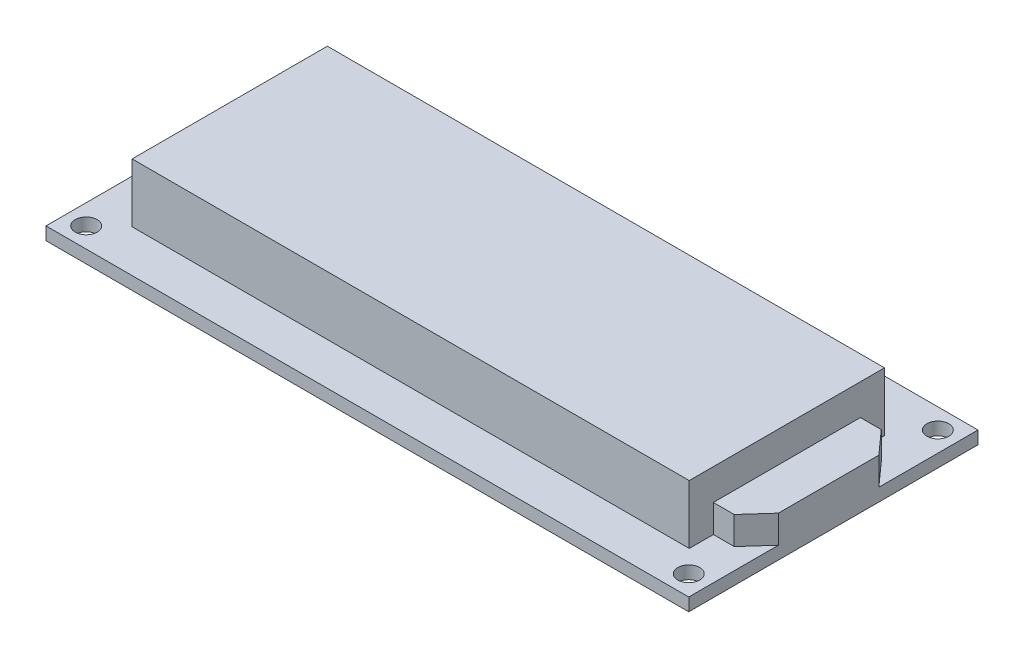
ISO-10303-21;
HEADER;
FILE_DESCRIPTION(('STEP AP214'),'2;1');
FILE_NAME('part.step','',(''),(''),'','','');
FILE_SCHEMA(('AUTOMOTIVE_DESIGN { 1 0 10303 214 1 1 1 1 }'));
ENDSEC;
DATA;
#1=APPLICATION_CONTEXT('core data for automotive mechanical design processes');
#2=APPLICATION_PROTOCOL_DEFINITION('international standard','automotive_design',2000,#1);
#3=PRODUCT_CONTEXT('',#1,'mechanical');
#4=PRODUCT('Part','Part','',(#3));
#5=PRODUCT_RELATED_PRODUCT_CATEGORY('part','',(#4));
#6=PRODUCT_DEFINITION_FORMATION('','',#4);
#7=PRODUCT_DEFINITION_CONTEXT('part definition',#1,'design');
#8=PRODUCT_DEFINITION('design','',#6,#7);
#9=PRODUCT_DEFINITION_SHAPE('','',#8);
#10=(LENGTH_UNIT() NAMED_UNIT(*) SI_UNIT(.MILLI.,.METRE.));
#11=(NAMED_UNIT(*) PLANE_ANGLE_UNIT() SI_UNIT($,.RADIAN.));
#12=(NAMED_UNIT(*) SI_UNIT($,.STERADIAN.) SOLID_ANGLE_UNIT());
#13=UNCERTAINTY_MEASURE_WITH_UNIT(LENGTH_MEASURE(1.E-05),#10,'distance_accuracy_value','');
#14=(GEOMETRIC_REPRESENTATION_CONTEXT(3) GLOBAL_UNCERTAINTY_ASSIGNED_CONTEXT((#13)) GLOBAL_UNIT_ASSIGNED_CONTEXT((#10,
#11,#12)) REPRESENTATION_CONTEXT('',''));
#15=CARTESIAN_POINT('',(0.,0.,0.));
#16=DIRECTION('',(0.,0.,1.));
#17=DIRECTION('',(1.,0.,0.));
#18=AXIS2_PLACEMENT_3D('',#15,#16,#17);
#19=CARTESIAN_POINT('',(0.,1.6,0.));
#20=DIRECTION('',(0.,-1.,0.));
#21=DIRECTION('',(0.,0.,-1.));
#22=AXIS2_PLACEMENT_3D('',#19,#20,#21);
#23=PLANE('',#22);
#24=CARTESIAN_POINT('',(37.5,1.6,-15.5));
#25=DIRECTION('',(0.,-1.,0.));
#26=DIRECTION('',(0.,0.,-1.));
#27=AXIS2_PLACEMENT_3D('',#24,#25,#26);
#28=CIRCLE('',#27,1.36);
#29=CARTESIAN_POINT('',(37.5,1.6,-16.86));
#30=VERTEX_POINT('',#29);
#31=EDGE_CURVE('E169',#30,#30,#28,.T.);
#32=ORIENTED_EDGE('',*,*,#31,.T.);
#33=EDGE_LOOP('',(#32));
#34=FACE_BOUND('',#33,.T.);
#35=CARTESIAN_POINT('',(37.5,1.6,15.5));
#36=DIRECTION('',(0.,-1.,0.));
#37=DIRECTION('',(0.,0.,-1.));
#38=AXIS2_PLACEMENT_3D('',#35,#36,#37);
#39=CIRCLE('',#38,1.36);
#40=CARTESIAN_POINT('',(37.5,1.6,14.14));
#41=VERTEX_POINT('',#40);
#42=EDGE_CURVE('E403',#41,#41,#39,.T.);
#43=ORIENTED_EDGE('',*,*,#42,.T.);
#44=EDGE_LOOP('',(#43));
#45=FACE_BOUND('',#44,.T.);
#46=CARTESIAN_POINT('',(-37.5,1.6,15.5));
#47=DIRECTION('',(0.,-1.,0.));
#48=DIRECTION('',(0.,0.,-1.));
#49=AXIS2_PLACEMENT_3D('',#46,#47,#48);
#50=CIRCLE('',#49,1.36);
#51=CARTESIAN_POINT('',(-37.5,1.6,14.14));
#52=VERTEX_POINT('',#51);
#53=EDGE_CURVE('E406',#52,#52,#50,.T.);
#54=ORIENTED_EDGE('',*,*,#53,.T.);
#55=EDGE_LOOP('',(#54));
#56=FACE_BOUND('',#55,.T.);
#57=CARTESIAN_POINT('',(-37.5,1.6,-15.5));
#58=DIRECTION('',(0.,-1.,0.));
#59=DIRECTION('',(0.,0.,-1.));
#60=AXIS2_PLACEMENT_3D('',#57,#58,#59);
#61=CIRCLE('',#60,1.36);
#62=CARTESIAN_POINT('',(-37.5,1.6,-16.86));
#63=VERTEX_POINT('',#62);
#64=EDGE_CURVE('E411',#63,#63,#61,.T.);
#65=ORIENTED_EDGE('',*,*,#64,.T.);
#66=EDGE_LOOP('',(#65));
#67=FACE_BOUND('',#66,.T.);
#68=DIRECTION('',(1.,0.,0.));
#69=VECTOR('',#68,1.);
#70=CARTESIAN_POINT('',(37.4,1.6,9.74));
#71=LINE('',#70,#69);
#72=CARTESIAN_POINT('',(34.8,1.6,9.74));
#73=VERTEX_POINT('',#72);
#74=CARTESIAN_POINT('',(37.4,1.6,9.74));
#75=VERTEX_POINT('',#74);
#76=EDGE_CURVE('E168',#73,#75,#71,.T.);
#77=ORIENTED_EDGE('',*,*,#76,.F.);
#78=DIRECTION('',(0.,0.,-1.));
#79=VECTOR('',#78,1.);
#80=CARTESIAN_POINT('',(34.8,1.6,-11.56));
#81=LINE('',#80,#79);
#82=CARTESIAN_POINT('',(34.8,1.6,12.74));
#83=VERTEX_POINT('',#82);
#84=EDGE_CURVE('E140',#83,#73,#81,.T.);
#85=ORIENTED_EDGE('',*,*,#84,.F.);
#86=DIRECTION('',(1.,0.,0.));
#87=VECTOR('',#86,1.);
#88=CARTESIAN_POINT('',(-34.54,1.6,12.74));
#89=LINE('',#88,#87);
#90=CARTESIAN_POINT('',(-34.54,1.6,12.74));
#91=VERTEX_POINT('',#90);
#92=EDGE_CURVE('E189',#91,#83,#89,.T.);
#93=ORIENTED_EDGE('',*,*,#92,.F.);
#94=DIRECTION('',(0.,0.,1.));
#95=VECTOR('',#94,1.);
#96=CARTESIAN_POINT('',(-34.54,1.6,-11.56));
#97=LINE('',#96,#95);
#98=CARTESIAN_POINT('',(-34.54,1.6,-11.56));
#99=VERTEX_POINT('',#98);
#100=EDGE_CURVE('E200',#99,#91,#97,.T.);
#101=ORIENTED_EDGE('',*,*,#100,.F.);
#102=DIRECTION('',(-1.,0.,0.));
#103=VECTOR('',#102,1.);
#104=CARTESIAN_POINT('',(-34.54,1.6,-11.56));
#105=LINE('',#104,#103);
#106=CARTESIAN_POINT('',(34.8,1.6,-11.56));
#107=VERTEX_POINT('',#106);
#108=EDGE_CURVE('E197',#107,#99,#105,.T.);
#109=ORIENTED_EDGE('',*,*,#108,.F.);
#110=CARTESIAN_POINT('',(34.8,1.6,-8.56));
#111=VERTEX_POINT('',#110);
#112=EDGE_CURVE('E184',#111,#107,#81,.T.);
#113=ORIENTED_EDGE('',*,*,#112,.F.);
#114=DIRECTION('',(-1.,0.,0.));
#115=VECTOR('',#114,1.);
#116=CARTESIAN_POINT('',(34.8,1.6,-8.56));
#117=LINE('',#116,#115);
#118=CARTESIAN_POINT('',(37.4,1.6,-8.56));
#119=VERTEX_POINT('',#118);
#120=EDGE_CURVE('E55',#119,#111,#117,.T.);
#121=ORIENTED_EDGE('',*,*,#120,.F.);
#122=DIRECTION('',(-0.667545015752028,0.,-0.744569440646489));
#123=VECTOR('',#122,1.);
#124=CARTESIAN_POINT('',(37.4,1.6,-8.56));
#125=LINE('',#124,#123);
#126=CARTESIAN_POINT('',(40.,1.6,-5.66));
#127=VERTEX_POINT('',#126);
#128=EDGE_CURVE('E172',#127,#119,#125,.T.);
#129=ORIENTED_EDGE('',*,*,#128,.F.);
#130=DIRECTION('',(0.,0.,-1.));
#131=VECTOR('',#130,1.);
#132=CARTESIAN_POINT('',(40.,1.6,-18.));
#133=LINE('',#132,#131);
#134=CARTESIAN_POINT('',(40.,1.6,-18.));
#135=VERTEX_POINT('',#134);
#136=EDGE_CURVE('E222',#127,#135,#133,.T.);
#137=ORIENTED_EDGE('',*,*,#136,.T.);
#138=DIRECTION('',(-1.,0.,0.));
#139=VECTOR('',#138,1.);
#140=CARTESIAN_POINT('',(40.,1.6,-18.));
#141=LINE('',#140,#139);
#142=CARTESIAN_POINT('',(-40.,1.6,-18.));
#143=VERTEX_POINT('',#142);
#144=EDGE_CURVE('E225',#135,#143,#141,.T.);
#145=ORIENTED_EDGE('',*,*,#144,.T.);
#146=DIRECTION('',(0.,0.,1.));
#147=VECTOR('',#146,1.);
#148=CARTESIAN_POINT('',(-40.,1.6,-18.));
#149=LINE('',#148,#147);
#150=CARTESIAN_POINT('',(-40.,1.6,18.));
#151=VERTEX_POINT('',#150);
#152=EDGE_CURVE('E216',#143,#151,#149,.T.);
#153=ORIENTED_EDGE('',*,*,#152,.T.);
#154=DIRECTION('',(1.,0.,0.));
#155=VECTOR('',#154,1.);
#156=CARTESIAN_POINT('',(40.,1.6,18.));
#157=LINE('',#156,#155);
#158=CARTESIAN_POINT('',(40.,1.6,18.));
#159=VERTEX_POINT('',#158);
#160=EDGE_CURVE('E219',#151,#159,#157,.T.);
#161=ORIENTED_EDGE('',*,*,#160,.T.);
#162=CARTESIAN_POINT('',(40.,1.6,6.84));
#163=VERTEX_POINT('',#162);
#164=EDGE_CURVE('E223',#159,#163,#133,.T.);
#165=ORIENTED_EDGE('',*,*,#164,.T.);
#166=DIRECTION('',(0.667545015752028,0.,-0.744569440646489));
#167=VECTOR('',#166,1.);
#168=CARTESIAN_POINT('',(40.,1.6,6.84));
#169=LINE('',#168,#167);
#170=EDGE_CURVE('E48',#75,#163,#169,.T.);
#171=ORIENTED_EDGE('',*,*,#170,.F.);
#172=EDGE_LOOP('',(#77,#85,#93,#101,#109,#113,#121,#129,#137,#145,#153,#161,#165,#171));
#173=FACE_BOUND('',#172,.T.);
#174=ADVANCED_FACE('F33',(#34,#45,#56,#67,#173),#23,.F.);
#175=CARTESIAN_POINT('',(34.8,8.92,-11.56));
#176=DIRECTION('',(-1.,0.,0.));
#177=DIRECTION('',(0.,0.,1.));
#178=AXIS2_PLACEMENT_3D('',#175,#176,#177);
#179=PLANE('',#178);
#180=DIRECTION('',(0.,-1.,0.));
#181=VECTOR('',#180,1.);
#182=CARTESIAN_POINT('',(34.8,5.06,-8.56));
#183=LINE('',#182,#181);
#184=CARTESIAN_POINT('',(34.8,5.06,-8.56));
#185=VERTEX_POINT('',#184);
#186=EDGE_CURVE('E143',#185,#111,#183,.T.);
#187=ORIENTED_EDGE('',*,*,#186,.T.);
#188=ORIENTED_EDGE('',*,*,#112,.T.);
#189=DIRECTION('',(0.,-1.,0.));
#190=VECTOR('',#189,1.);
#191=CARTESIAN_POINT('',(34.8,8.92,-11.56));
#192=LINE('',#191,#190);
#193=CARTESIAN_POINT('',(34.8,8.92,-11.56));
#194=VERTEX_POINT('',#193);
#195=EDGE_CURVE('E212',#194,#107,#192,.T.);
#196=ORIENTED_EDGE('',*,*,#195,.F.);
#197=DIRECTION('',(0.,0.,-1.));
#198=VECTOR('',#197,1.);
#199=CARTESIAN_POINT('',(34.8,8.92,-11.56));
#200=LINE('',#199,#198);
#201=CARTESIAN_POINT('',(34.8,8.92,12.74));
#202=VERTEX_POINT('',#201);
#203=EDGE_CURVE('E185',#202,#194,#200,.T.);
#204=ORIENTED_EDGE('',*,*,#203,.F.);
#205=DIRECTION('',(0.,-1.,0.));
#206=VECTOR('',#205,1.);
#207=CARTESIAN_POINT('',(34.8,8.92,12.74));
#208=LINE('',#207,#206);
#209=EDGE_CURVE('E195',#202,#83,#208,.T.);
#210=ORIENTED_EDGE('',*,*,#209,.T.);
#211=ORIENTED_EDGE('',*,*,#84,.T.);
#212=DIRECTION('',(0.,-1.,0.));
#213=VECTOR('',#212,1.);
#214=CARTESIAN_POINT('',(34.8,5.06,9.74));
#215=LINE('',#214,#213);
#216=CARTESIAN_POINT('',(34.8,5.06,9.74));
#217=VERTEX_POINT('',#216);
#218=EDGE_CURVE('E134',#217,#73,#215,.T.);
#219=ORIENTED_EDGE('',*,*,#218,.F.);
#220=DIRECTION('',(0.,0.,1.));
#221=VECTOR('',#220,1.);
#222=CARTESIAN_POINT('',(34.8,5.06,9.74));
#223=LINE('',#222,#221);
#224=EDGE_CURVE('E137',#185,#217,#223,.T.);
#225=ORIENTED_EDGE('',*,*,#224,.F.);
#226=EDGE_LOOP('',(#187,#188,#196,#204,#210,#211,#219,#225));
#227=FACE_BOUND('',#226,.T.);
#228=ADVANCED_FACE('F136',(#227),#179,.F.);
#229=CARTESIAN_POINT('',(-40.,1.6,-18.));
#230=DIRECTION('',(1.,0.,0.));
#231=DIRECTION('',(0.,0.,-1.));
#232=AXIS2_PLACEMENT_3D('',#229,#230,#231);
#233=PLANE('',#232);
#234=DIRECTION('',(0.,0.,1.));
#235=VECTOR('',#234,1.);
#236=CARTESIAN_POINT('',(-40.,0.,-18.));
#237=LINE('',#236,#235);
#238=CARTESIAN_POINT('',(-40.,0.,-18.));
#239=VERTEX_POINT('',#238);
#240=CARTESIAN_POINT('',(-40.,0.,18.));
#241=VERTEX_POINT('',#240);
#242=EDGE_CURVE('E215',#239,#241,#237,.T.);
#243=ORIENTED_EDGE('',*,*,#242,.T.);
#244=DIRECTION('',(0.,-1.,0.));
#245=VECTOR('',#244,1.);
#246=CARTESIAN_POINT('',(-40.,1.6,18.));
#247=LINE('',#246,#245);
#248=EDGE_CURVE('E11',#151,#241,#247,.T.);
#249=ORIENTED_EDGE('',*,*,#248,.F.);
#250=ORIENTED_EDGE('',*,*,#152,.F.);
#251=DIRECTION('',(0.,-1.,0.));
#252=VECTOR('',#251,1.);
#253=CARTESIAN_POINT('',(-40.,1.6,-18.));
#254=LINE('',#253,#252);
#255=EDGE_CURVE('E227',#143,#239,#254,.T.);
#256=ORIENTED_EDGE('',*,*,#255,.T.);
#257=EDGE_LOOP('',(#243,#249,#250,#256));
#258=FACE_BOUND('',#257,.T.);
#259=ADVANCED_FACE('F35',(#258),#233,.F.);
#260=CARTESIAN_POINT('',(40.,1.6,18.));
#261=DIRECTION('',(0.,0.,-1.));
#262=DIRECTION('',(-1.,0.,0.));
#263=AXIS2_PLACEMENT_3D('',#260,#261,#262);
#264=PLANE('',#263);
#265=DIRECTION('',(1.,0.,0.));
#266=VECTOR('',#265,1.);
#267=CARTESIAN_POINT('',(40.,0.,18.));
#268=LINE('',#267,#266);
#269=CARTESIAN_POINT('',(40.,0.,18.));
#270=VERTEX_POINT('',#269);
#271=EDGE_CURVE('E230',#241,#270,#268,.T.);
#272=ORIENTED_EDGE('',*,*,#271,.T.);
#273=DIRECTION('',(0.,-1.,0.));
#274=VECTOR('',#273,1.);
#275=CARTESIAN_POINT('',(40.,1.6,18.));
#276=LINE('',#275,#274);
#277=EDGE_CURVE('E41',#159,#270,#276,.T.);
#278=ORIENTED_EDGE('',*,*,#277,.F.);
#279=ORIENTED_EDGE('',*,*,#160,.F.);
#280=ORIENTED_EDGE('',*,*,#248,.T.);
#281=EDGE_LOOP('',(#272,#278,#279,#280));
#282=FACE_BOUND('',#281,.T.);
#283=ADVANCED_FACE('F296',(#282),#264,.F.);
#284=CARTESIAN_POINT('',(40.,1.6,-18.));
#285=DIRECTION('',(-1.,0.,0.));
#286=DIRECTION('',(0.,0.,1.));
#287=AXIS2_PLACEMENT_3D('',#284,#285,#286);
#288=PLANE('',#287);
#289=DIRECTION('',(0.,0.,-1.));
#290=VECTOR('',#289,1.);
#291=CARTESIAN_POINT('',(40.,0.,-18.));
#292=LINE('',#291,#290);
#293=CARTESIAN_POINT('',(40.,0.,-18.));
#294=VERTEX_POINT('',#293);
#295=EDGE_CURVE('E232',#270,#294,#292,.T.);
#296=ORIENTED_EDGE('',*,*,#295,.T.);
#297=DIRECTION('',(0.,-1.,0.));
#298=VECTOR('',#297,1.);
#299=CARTESIAN_POINT('',(40.,1.6,-18.));
#300=LINE('',#299,#298);
#301=EDGE_CURVE('E237',#135,#294,#300,.T.);
#302=ORIENTED_EDGE('',*,*,#301,.F.);
#303=ORIENTED_EDGE('',*,*,#136,.F.);
#304=DIRECTION('',(0.,-1.,0.));
#305=VECTOR('',#304,1.);
#306=CARTESIAN_POINT('',(40.,5.06,-5.66));
#307=LINE('',#306,#305);
#308=CARTESIAN_POINT('',(40.,5.06,-5.66));
#309=VERTEX_POINT('',#308);
#310=EDGE_CURVE('E176',#309,#127,#307,.T.);
#311=ORIENTED_EDGE('',*,*,#310,.F.);
#312=DIRECTION('',(0.,0.,-1.));
#313=VECTOR('',#312,1.);
#314=CARTESIAN_POINT('',(40.,5.06,-5.66));
#315=LINE('',#314,#313);
#316=CARTESIAN_POINT('',(40.,5.06,6.84));
#317=VERTEX_POINT('',#316);
#318=EDGE_CURVE('E159',#317,#309,#315,.T.);
#319=ORIENTED_EDGE('',*,*,#318,.F.);
#320=DIRECTION('',(0.,-1.,0.));
#321=VECTOR('',#320,1.);
#322=CARTESIAN_POINT('',(40.,5.06,6.84));
#323=LINE('',#322,#321);
#324=EDGE_CURVE('E179',#317,#163,#323,.T.);
#325=ORIENTED_EDGE('',*,*,#324,.T.);
#326=ORIENTED_EDGE('',*,*,#164,.F.);
#327=ORIENTED_EDGE('',*,*,#277,.T.);
#328=EDGE_LOOP('',(#296,#302,#303,#311,#319,#325,#326,#327));
#329=FACE_BOUND('',#328,.T.);
#330=ADVANCED_FACE('F244',(#329),#288,.F.);
#331=CARTESIAN_POINT('',(40.,1.6,-18.));
#332=DIRECTION('',(0.,0.,1.));
#333=DIRECTION('',(1.,0.,0.));
#334=AXIS2_PLACEMENT_3D('',#331,#332,#333);
#335=PLANE('',#334);
#336=DIRECTION('',(-1.,0.,0.));
#337=VECTOR('',#336,1.);
#338=CARTESIAN_POINT('',(40.,0.,-18.));
#339=LINE('',#338,#337);
#340=EDGE_CURVE('E220',#294,#239,#339,.T.);
#341=ORIENTED_EDGE('',*,*,#340,.T.);
#342=ORIENTED_EDGE('',*,*,#255,.F.);
#343=ORIENTED_EDGE('',*,*,#144,.F.);
#344=ORIENTED_EDGE('',*,*,#301,.T.);
#345=EDGE_LOOP('',(#341,#342,#343,#344));
#346=FACE_BOUND('',#345,.T.);
#347=ADVANCED_FACE('F253',(#346),#335,.F.);
#348=CARTESIAN_POINT('',(0.,0.,0.));
#349=DIRECTION('',(0.,-1.,0.));
#350=DIRECTION('',(0.,0.,-1.));
#351=AXIS2_PLACEMENT_3D('',#348,#349,#350);
#352=PLANE('',#351);
#353=CARTESIAN_POINT('',(37.5,0.,-15.5));
#354=DIRECTION('',(0.,1.,0.));
#355=DIRECTION('',(0.,0.,1.));
#356=AXIS2_PLACEMENT_3D('',#353,#354,#355);
#357=CIRCLE('',#356,1.36);
#358=CARTESIAN_POINT('',(37.5,0.,-14.14));
#359=VERTEX_POINT('',#358);
#360=EDGE_CURVE('E401',#359,#359,#357,.T.);
#361=ORIENTED_EDGE('',*,*,#360,.T.);
#362=EDGE_LOOP('',(#361));
#363=FACE_BOUND('',#362,.T.);
#364=CARTESIAN_POINT('',(37.5,0.,15.5));
#365=DIRECTION('',(0.,1.,0.));
#366=DIRECTION('',(0.,0.,1.));
#367=AXIS2_PLACEMENT_3D('',#364,#365,#366);
#368=CIRCLE('',#367,1.36);
#369=CARTESIAN_POINT('',(37.5,0.,16.86));
#370=VERTEX_POINT('',#369);
#371=EDGE_CURVE('E419',#370,#370,#368,.T.);
#372=ORIENTED_EDGE('',*,*,#371,.T.);
#373=EDGE_LOOP('',(#372));
#374=FACE_BOUND('',#373,.T.);
#375=CARTESIAN_POINT('',(-37.5,0.,15.5));
#376=DIRECTION('',(0.,1.,0.));
#377=DIRECTION('',(0.,0.,1.));
#378=AXIS2_PLACEMENT_3D('',#375,#376,#377);
#379=CIRCLE('',#378,1.36);
#380=CARTESIAN_POINT('',(-37.5,0.,16.86));
#381=VERTEX_POINT('',#380);
#382=EDGE_CURVE('E417',#381,#381,#379,.T.);
#383=ORIENTED_EDGE('',*,*,#382,.T.);
#384=EDGE_LOOP('',(#383));
#385=FACE_BOUND('',#384,.T.);
#386=CARTESIAN_POINT('',(-37.5,0.,-15.5));
#387=DIRECTION('',(0.,1.,0.));
#388=DIRECTION('',(0.,0.,1.));
#389=AXIS2_PLACEMENT_3D('',#386,#387,#388);
#390=CIRCLE('',#389,1.36);
#391=CARTESIAN_POINT('',(-37.5,0.,-14.14));
#392=VERTEX_POINT('',#391);
#393=EDGE_CURVE('E414',#392,#392,#390,.T.);
#394=ORIENTED_EDGE('',*,*,#393,.T.);
#395=EDGE_LOOP('',(#394));
#396=FACE_BOUND('',#395,.T.);
#397=ORIENTED_EDGE('',*,*,#242,.F.);
#398=ORIENTED_EDGE('',*,*,#340,.F.);
#399=ORIENTED_EDGE('',*,*,#295,.F.);
#400=ORIENTED_EDGE('',*,*,#271,.F.);
#401=EDGE_LOOP('',(#397,#398,#399,#400));
#402=FACE_BOUND('',#401,.T.);
#403=ADVANCED_FACE('F250',(#363,#374,#385,#396,#402),#352,.T.);
#404=CARTESIAN_POINT('',(-34.54,8.92,-11.56));
#405=DIRECTION('',(0.,0.,1.));
#406=DIRECTION('',(1.,0.,0.));
#407=AXIS2_PLACEMENT_3D('',#404,#405,#406);
#408=PLANE('',#407);
#409=ORIENTED_EDGE('',*,*,#108,.T.);
#410=DIRECTION('',(0.,-1.,0.));
#411=VECTOR('',#410,1.);
#412=CARTESIAN_POINT('',(-34.54,8.92,-11.56));
#413=LINE('',#412,#411);
#414=CARTESIAN_POINT('',(-34.54,8.92,-11.56));
#415=VERTEX_POINT('',#414);
#416=EDGE_CURVE('E209',#415,#99,#413,.T.);
#417=ORIENTED_EDGE('',*,*,#416,.F.);
#418=DIRECTION('',(-1.,0.,0.));
#419=VECTOR('',#418,1.);
#420=CARTESIAN_POINT('',(-34.54,8.92,-11.56));
#421=LINE('',#420,#419);
#422=EDGE_CURVE('E188',#194,#415,#421,.T.);
#423=ORIENTED_EDGE('',*,*,#422,.F.);
#424=ORIENTED_EDGE('',*,*,#195,.T.);
#425=EDGE_LOOP('',(#409,#417,#423,#424));
#426=FACE_BOUND('',#425,.T.);
#427=ADVANCED_FACE('F291',(#426),#408,.F.);
#428=CARTESIAN_POINT('',(-34.54,8.92,-11.56));
#429=DIRECTION('',(1.,0.,0.));
#430=DIRECTION('',(0.,0.,-1.));
#431=AXIS2_PLACEMENT_3D('',#428,#429,#430);
#432=PLANE('',#431);
#433=ORIENTED_EDGE('',*,*,#100,.T.);
#434=DIRECTION('',(0.,-1.,0.));
#435=VECTOR('',#434,1.);
#436=CARTESIAN_POINT('',(-34.54,8.92,12.74));
#437=LINE('',#436,#435);
#438=CARTESIAN_POINT('',(-34.54,8.92,12.74));
#439=VERTEX_POINT('',#438);
#440=EDGE_CURVE('E206',#439,#91,#437,.T.);
#441=ORIENTED_EDGE('',*,*,#440,.F.);
#442=DIRECTION('',(0.,0.,1.));
#443=VECTOR('',#442,1.);
#444=CARTESIAN_POINT('',(-34.54,8.92,-11.56));
#445=LINE('',#444,#443);
#446=EDGE_CURVE('E191',#415,#439,#445,.T.);
#447=ORIENTED_EDGE('',*,*,#446,.F.);
#448=ORIENTED_EDGE('',*,*,#416,.T.);
#449=EDGE_LOOP('',(#433,#441,#447,#448));
#450=FACE_BOUND('',#449,.T.);
#451=ADVANCED_FACE('F450',(#450),#432,.F.);
#452=CARTESIAN_POINT('',(-34.54,8.92,12.74));
#453=DIRECTION('',(0.,0.,-1.));
#454=DIRECTION('',(-1.,0.,0.));
#455=AXIS2_PLACEMENT_3D('',#452,#453,#454);
#456=PLANE('',#455);
#457=ORIENTED_EDGE('',*,*,#92,.T.);
#458=ORIENTED_EDGE('',*,*,#209,.F.);
#459=DIRECTION('',(1.,0.,0.));
#460=VECTOR('',#459,1.);
#461=CARTESIAN_POINT('',(-34.54,8.92,12.74));
#462=LINE('',#461,#460);
#463=EDGE_CURVE('E193',#439,#202,#462,.T.);
#464=ORIENTED_EDGE('',*,*,#463,.F.);
#465=ORIENTED_EDGE('',*,*,#440,.T.);
#466=EDGE_LOOP('',(#457,#458,#464,#465));
#467=FACE_BOUND('',#466,.T.);
#468=ADVANCED_FACE('F456',(#467),#456,.F.);
#469=CARTESIAN_POINT('',(0.,8.92,0.));
#470=DIRECTION('',(0.,1.,0.));
#471=DIRECTION('',(0.,0.,1.));
#472=AXIS2_PLACEMENT_3D('',#469,#470,#471);
#473=PLANE('',#472);
#474=ORIENTED_EDGE('',*,*,#203,.T.);
#475=ORIENTED_EDGE('',*,*,#422,.T.);
#476=ORIENTED_EDGE('',*,*,#446,.T.);
#477=ORIENTED_EDGE('',*,*,#463,.T.);
#478=EDGE_LOOP('',(#474,#475,#476,#477));
#479=FACE_BOUND('',#478,.T.);
#480=ADVANCED_FACE('F333',(#479),#473,.T.);
#481=CARTESIAN_POINT('',(34.8,5.06,-8.56));
#482=DIRECTION('',(0.,0.,1.));
#483=DIRECTION('',(1.,0.,0.));
#484=AXIS2_PLACEMENT_3D('',#481,#482,#483);
#485=PLANE('',#484);
#486=ORIENTED_EDGE('',*,*,#120,.T.);
#487=ORIENTED_EDGE('',*,*,#186,.F.);
#488=DIRECTION('',(-1.,0.,0.));
#489=VECTOR('',#488,1.);
#490=CARTESIAN_POINT('',(34.8,5.06,-8.56));
#491=LINE('',#490,#489);
#492=CARTESIAN_POINT('',(37.4,5.06,-8.56));
#493=VERTEX_POINT('',#492);
#494=EDGE_CURVE('E151',#493,#185,#491,.T.);
#495=ORIENTED_EDGE('',*,*,#494,.F.);
#496=DIRECTION('',(0.,-1.,0.));
#497=VECTOR('',#496,1.);
#498=CARTESIAN_POINT('',(37.4,5.06,-8.56));
#499=LINE('',#498,#497);
#500=EDGE_CURVE('E166',#493,#119,#499,.T.);
#501=ORIENTED_EDGE('',*,*,#500,.T.);
#502=EDGE_LOOP('',(#486,#487,#495,#501));
#503=FACE_BOUND('',#502,.T.);
#504=ADVANCED_FACE('F275',(#503),#485,.F.);
#505=CARTESIAN_POINT('',(37.4,5.06,9.74));
#506=DIRECTION('',(0.,0.,-1.));
#507=DIRECTION('',(-1.,0.,0.));
#508=AXIS2_PLACEMENT_3D('',#505,#506,#507);
#509=PLANE('',#508);
#510=ORIENTED_EDGE('',*,*,#76,.T.);
#511=DIRECTION('',(0.,-1.,0.));
#512=VECTOR('',#511,1.);
#513=CARTESIAN_POINT('',(37.4,5.06,9.74));
#514=LINE('',#513,#512);
#515=CARTESIAN_POINT('',(37.4,5.06,9.74));
#516=VERTEX_POINT('',#515);
#517=EDGE_CURVE('E144',#516,#75,#514,.T.);
#518=ORIENTED_EDGE('',*,*,#517,.F.);
#519=DIRECTION('',(1.,0.,0.));
#520=VECTOR('',#519,1.);
#521=CARTESIAN_POINT('',(37.4,5.06,9.74));
#522=LINE('',#521,#520);
#523=EDGE_CURVE('E148',#217,#516,#522,.T.);
#524=ORIENTED_EDGE('',*,*,#523,.F.);
#525=ORIENTED_EDGE('',*,*,#218,.T.);
#526=EDGE_LOOP('',(#510,#518,#524,#525));
#527=FACE_BOUND('',#526,.T.);
#528=ADVANCED_FACE('F154',(#527),#509,.F.);
#529=CARTESIAN_POINT('',(40.,5.06,6.84));
#530=DIRECTION('',(-0.744569440646489,0.,-0.667545015752028));
#531=DIRECTION('',(-0.667545015752028,0.,0.744569440646489));
#532=AXIS2_PLACEMENT_3D('',#529,#530,#531);
#533=PLANE('',#532);
#534=ORIENTED_EDGE('',*,*,#170,.T.);
#535=ORIENTED_EDGE('',*,*,#324,.F.);
#536=DIRECTION('',(0.667545015752028,0.,-0.744569440646489));
#537=VECTOR('',#536,1.);
#538=CARTESIAN_POINT('',(40.,5.06,6.84));
#539=LINE('',#538,#537);
#540=EDGE_CURVE('E157',#516,#317,#539,.T.);
#541=ORIENTED_EDGE('',*,*,#540,.F.);
#542=ORIENTED_EDGE('',*,*,#517,.T.);
#543=EDGE_LOOP('',(#534,#535,#541,#542));
#544=FACE_BOUND('',#543,.T.);
#545=ADVANCED_FACE('F267',(#544),#533,.F.);
#546=CARTESIAN_POINT('',(37.4,5.06,-8.56));
#547=DIRECTION('',(-0.744569440646489,0.,0.667545015752028));
#548=DIRECTION('',(0.667545015752028,0.,0.744569440646489));
#549=AXIS2_PLACEMENT_3D('',#546,#547,#548);
#550=PLANE('',#549);
#551=ORIENTED_EDGE('',*,*,#128,.T.);
#552=ORIENTED_EDGE('',*,*,#500,.F.);
#553=DIRECTION('',(-0.667545015752028,0.,-0.744569440646489));
#554=VECTOR('',#553,1.);
#555=CARTESIAN_POINT('',(37.4,5.06,-8.56));
#556=LINE('',#555,#554);
#557=EDGE_CURVE('E164',#309,#493,#556,.T.);
#558=ORIENTED_EDGE('',*,*,#557,.F.);
#559=ORIENTED_EDGE('',*,*,#310,.T.);
#560=EDGE_LOOP('',(#551,#552,#558,#559));
#561=FACE_BOUND('',#560,.T.);
#562=ADVANCED_FACE('F263',(#561),#550,.F.);
#563=CARTESIAN_POINT('',(0.,5.06,0.));
#564=DIRECTION('',(0.,-1.,0.));
#565=DIRECTION('',(0.,0.,-1.));
#566=AXIS2_PLACEMENT_3D('',#563,#564,#565);
#567=PLANE('',#566);
#568=ORIENTED_EDGE('',*,*,#494,.T.);
#569=ORIENTED_EDGE('',*,*,#224,.T.);
#570=ORIENTED_EDGE('',*,*,#523,.T.);
#571=ORIENTED_EDGE('',*,*,#540,.T.);
#572=ORIENTED_EDGE('',*,*,#318,.T.);
#573=ORIENTED_EDGE('',*,*,#557,.T.);
#574=EDGE_LOOP('',(#568,#569,#570,#571,#572,#573));
#575=FACE_BOUND('',#574,.T.);
#576=ADVANCED_FACE('F147',(#575),#567,.F.);
#577=CARTESIAN_POINT('',(-37.5,0.,-15.5));
#578=DIRECTION('',(0.,1.,0.));
#579=DIRECTION('',(0.,0.,1.));
#580=AXIS2_PLACEMENT_3D('',#577,#578,#579);
#581=CYLINDRICAL_SURFACE('',#580,1.36);
#582=ORIENTED_EDGE('',*,*,#393,.F.);
#583=EDGE_LOOP('',(#582));
#584=FACE_BOUND('',#583,.T.);
#585=ORIENTED_EDGE('',*,*,#64,.F.);
#586=EDGE_LOOP('',(#585));
#587=FACE_BOUND('',#586,.T.);
#588=ADVANCED_FACE('F355',(#584,#587),#581,.F.);
#589=CARTESIAN_POINT('',(-37.5,0.,15.5));
#590=DIRECTION('',(0.,1.,0.));
#591=DIRECTION('',(0.,0.,1.));
#592=AXIS2_PLACEMENT_3D('',#589,#590,#591);
#593=CYLINDRICAL_SURFACE('',#592,1.36);
#594=ORIENTED_EDGE('',*,*,#382,.F.);
#595=EDGE_LOOP('',(#594));
#596=FACE_BOUND('',#595,.T.);
#597=ORIENTED_EDGE('',*,*,#53,.F.);
#598=EDGE_LOOP('',(#597));
#599=FACE_BOUND('',#598,.T.);
#600=ADVANCED_FACE('F363',(#596,#599),#593,.F.);
#601=CARTESIAN_POINT('',(37.5,0.,15.5));
#602=DIRECTION('',(0.,1.,0.));
#603=DIRECTION('',(0.,0.,1.));
#604=AXIS2_PLACEMENT_3D('',#601,#602,#603);
#605=CYLINDRICAL_SURFACE('',#604,1.36);
#606=ORIENTED_EDGE('',*,*,#371,.F.);
#607=EDGE_LOOP('',(#606));
#608=FACE_BOUND('',#607,.T.);
#609=ORIENTED_EDGE('',*,*,#42,.F.);
#610=EDGE_LOOP('',(#609));
#611=FACE_BOUND('',#610,.T.);
#612=ADVANCED_FACE('F372',(#608,#611),#605,.F.);
#613=CARTESIAN_POINT('',(37.5,0.,-15.5));
#614=DIRECTION('',(0.,1.,0.));
#615=DIRECTION('',(0.,0.,1.));
#616=AXIS2_PLACEMENT_3D('',#613,#614,#615);
#617=CYLINDRICAL_SURFACE('',#616,1.36);
#618=ORIENTED_EDGE('',*,*,#360,.F.);
#619=EDGE_LOOP('',(#618));
#620=FACE_BOUND('',#619,.T.);
#621=ORIENTED_EDGE('',*,*,#31,.F.);
#622=EDGE_LOOP('',(#621));
#623=FACE_BOUND('',#622,.T.);
#624=ADVANCED_FACE('F381',(#620,#623),#617,.F.);
#625=CLOSED_SHELL('',(#174,#228,#259,#283,#330,#347,#403,#427,#451,#468,#480,#504,#528,#545,
#562,#576,#588,#600,#612,#624));
#626=MANIFOLD_SOLID_BREP('B2',#625);
#627=ADVANCED_BREP_SHAPE_REPRESENTATION('',(#18,#626),#14);
#628=SHAPE_DEFINITION_REPRESENTATION(#9,#627);
ENDSEC;
END-ISO-10303-21;
